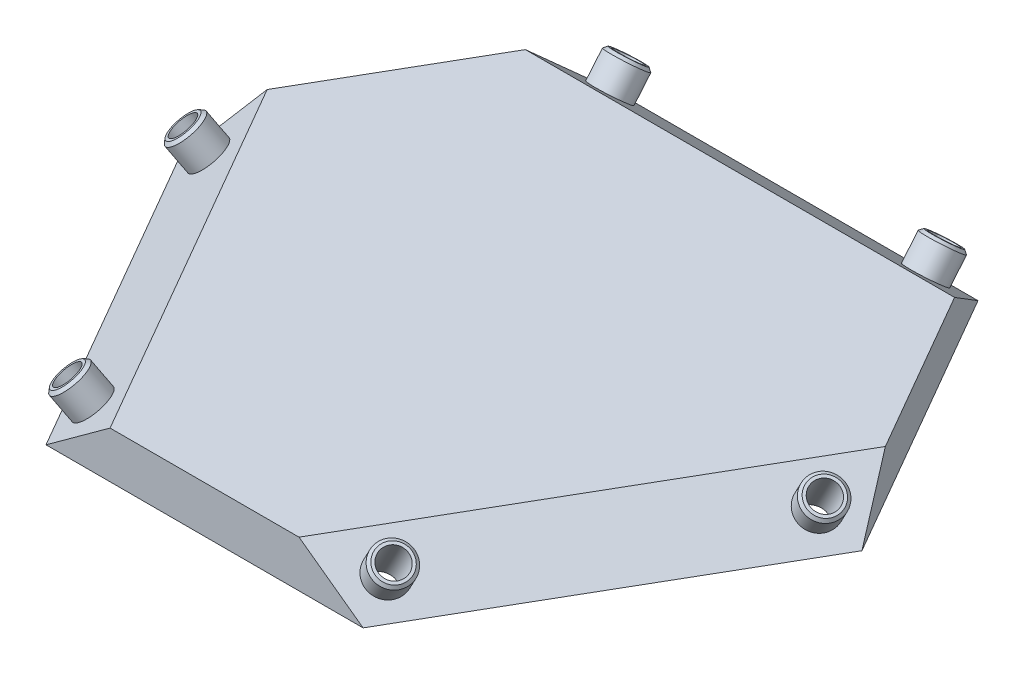
ISO-10303-21;
HEADER;
FILE_DESCRIPTION(('STEP AP214'),'2;1');
FILE_NAME('part.step','',(''),(''),'','','');
FILE_SCHEMA(('AUTOMOTIVE_DESIGN { 1 0 10303 214 1 1 1 1 }'));
ENDSEC;
DATA;
#1=APPLICATION_CONTEXT('core data for automotive mechanical design processes');
#2=APPLICATION_PROTOCOL_DEFINITION('international standard','automotive_design',2000,#1);
#3=PRODUCT_CONTEXT('',#1,'mechanical');
#4=PRODUCT('Part','Part','',(#3));
#5=PRODUCT_RELATED_PRODUCT_CATEGORY('part','',(#4));
#6=PRODUCT_DEFINITION_FORMATION('','',#4);
#7=PRODUCT_DEFINITION_CONTEXT('part definition',#1,'design');
#8=PRODUCT_DEFINITION('design','',#6,#7);
#9=PRODUCT_DEFINITION_SHAPE('','',#8);
#10=(LENGTH_UNIT() NAMED_UNIT(*) SI_UNIT(.MILLI.,.METRE.));
#11=(NAMED_UNIT(*) PLANE_ANGLE_UNIT() SI_UNIT($,.RADIAN.));
#12=(NAMED_UNIT(*) SI_UNIT($,.STERADIAN.) SOLID_ANGLE_UNIT());
#13=UNCERTAINTY_MEASURE_WITH_UNIT(LENGTH_MEASURE(1.E-05),#10,'distance_accuracy_value','');
#14=(GEOMETRIC_REPRESENTATION_CONTEXT(3) GLOBAL_UNCERTAINTY_ASSIGNED_CONTEXT((#13)) GLOBAL_UNIT_ASSIGNED_CONTEXT((#10,
#11,#12)) REPRESENTATION_CONTEXT('',''));
#15=CARTESIAN_POINT('',(0.,0.,0.));
#16=DIRECTION('',(0.,0.,1.));
#17=DIRECTION('',(1.,0.,0.));
#18=AXIS2_PLACEMENT_3D('',#15,#16,#17);
#19=CARTESIAN_POINT('',(0.,8.,-40.043988301124));
#20=DIRECTION('',(0.,0.766044443118981,-0.642787609686536));
#21=DIRECTION('',(1.,0.,0.));
#22=AXIS2_PLACEMENT_3D('',#19,#20,#21);
#23=PLANE('',#22);
#24=CARTESIAN_POINT('',(-27.1283555449519,3.99999999999999,-44.8110026715009));
#25=DIRECTION('',(0.,0.766044443118981,-0.642787609686536));
#26=DIRECTION('',(0.,0.642787609686536,0.766044443118981));
#27=AXIS2_PLACEMENT_3D('',#24,#25,#26);
#28=CIRCLE('',#27,3.30000000000001);
#29=CARTESIAN_POINT('',(-27.1283555449519,6.12119911196556,-42.2830560092083));
#30=VERTEX_POINT('',#29);
#31=EDGE_CURVE('E323',#30,#30,#28,.T.);
#32=ORIENTED_EDGE('',*,*,#31,.F.);
#33=EDGE_LOOP('',(#32));
#34=FACE_BOUND('',#33,.T.);
#35=DIRECTION('',(0.404481746652007,0.587858883152551,0.70058293593548));
#36=VECTOR('',#35,1.);
#37=CARTESIAN_POINT('',(30.8467253995562,-0.76940046901987,-50.4949528149759));
#38=LINE('',#37,#36);
#39=CARTESIAN_POINT('',(31.376118514984,0.,-49.5780170418778));
#40=VERTEX_POINT('',#39);
#41=CARTESIAN_POINT('',(36.8805925749198,8.,-40.043988301124));
#42=VERTEX_POINT('',#41);
#43=EDGE_CURVE('E146',#40,#42,#38,.T.);
#44=ORIENTED_EDGE('',*,*,#43,.F.);
#45=DIRECTION('',(1.,0.,0.));
#46=VECTOR('',#45,1.);
#47=CARTESIAN_POINT('',(0.,0.,-49.5780170418778));
#48=LINE('',#47,#46);
#49=CARTESIAN_POINT('',(-31.376118514984,0.,-49.5780170418778));
#50=VERTEX_POINT('',#49);
#51=EDGE_CURVE('E99',#50,#40,#48,.T.);
#52=ORIENTED_EDGE('',*,*,#51,.F.);
#53=DIRECTION('',(0.404481746652007,-0.587858883152551,-0.70058293593548));
#54=VECTOR('',#53,1.);
#55=CARTESIAN_POINT('',(-30.8467253995562,-0.769400469019868,-50.4949528149759));
#56=LINE('',#55,#54);
#57=CARTESIAN_POINT('',(-36.8805925749198,8.,-40.043988301124));
#58=VERTEX_POINT('',#57);
#59=EDGE_CURVE('E94',#58,#50,#56,.T.);
#60=ORIENTED_EDGE('',*,*,#59,.F.);
#61=DIRECTION('',(-1.,0.,0.));
#62=VECTOR('',#61,1.);
#63=CARTESIAN_POINT('',(-30.,8.,-40.043988301124));
#64=LINE('',#63,#62);
#65=EDGE_CURVE('E98',#42,#58,#64,.T.);
#66=ORIENTED_EDGE('',*,*,#65,.F.);
#67=EDGE_LOOP('',(#44,#52,#60,#66));
#68=FACE_BOUND('',#67,.T.);
#69=CARTESIAN_POINT('',(27.128355544952,3.99999999999999,-44.8110026715009));
#70=DIRECTION('',(0.,0.766044443118981,-0.642787609686536));
#71=DIRECTION('',(0.,0.642787609686536,0.766044443118981));
#72=AXIS2_PLACEMENT_3D('',#69,#70,#71);
#73=CIRCLE('',#72,3.3);
#74=CARTESIAN_POINT('',(27.128355544952,6.12119911196556,-42.2830560092083));
#75=VERTEX_POINT('',#74);
#76=EDGE_CURVE('E329',#75,#75,#73,.T.);
#77=ORIENTED_EDGE('',*,*,#76,.F.);
#78=EDGE_LOOP('',(#77));
#79=FACE_BOUND('',#78,.T.);
#80=ADVANCED_FACE('F39',(#34,#68,#79),#23,.T.);
#81=CARTESIAN_POINT('',(-34.6791111376203,8.,20.021994150562));
#82=DIRECTION('',(-0.556670399226416,0.766044443118981,0.321393804843268));
#83=DIRECTION('',(-0.5,0.,-0.866025403784439));
#84=AXIS2_PLACEMENT_3D('',#81,#82,#83);
#85=PLANE('',#84);
#86=CARTESIAN_POINT('',(-52.3716444550481,3.99999999999999,-1.08834372907434));
#87=DIRECTION('',(-0.556670399226417,0.766044443118981,0.321393804843268));
#88=DIRECTION('',(-0.808963493304015,-0.587858883152552,0.));
#89=AXIS2_PLACEMENT_3D('',#86,#87,#88);
#90=CIRCLE('',#89,3.3);
#91=CARTESIAN_POINT('',(-55.0412239829513,2.06006568559657,-1.08834372907434));
#92=VERTEX_POINT('',#91);
#93=EDGE_CURVE('E310',#92,#92,#90,.T.);
#94=ORIENTED_EDGE('',*,*,#93,.F.);
#95=EDGE_LOOP('',(#94));
#96=FACE_BOUND('',#95,.T.);
#97=DIRECTION('',(0.404481746652007,0.587858883152551,-0.70058293593548));
#98=VECTOR('',#97,1.);
#99=CARTESIAN_POINT('',(-59.1532746004438,-0.769400469019871,-1.46657141209043));
#100=LINE('',#99,#98);
#101=CARTESIAN_POINT('',(-58.623881485016,0.,-2.38350718518854));
#102=VERTEX_POINT('',#101);
#103=CARTESIAN_POINT('',(-53.1194074250802,8.,-11.9175359259423));
#104=VERTEX_POINT('',#103);
#105=EDGE_CURVE('E104',#102,#104,#100,.T.);
#106=ORIENTED_EDGE('',*,*,#105,.F.);
#107=DIRECTION('',(-0.5,0.,-0.866025403784439));
#108=VECTOR('',#107,1.);
#109=CARTESIAN_POINT('',(-42.935822227524,0.,24.7890085209389));
#110=LINE('',#109,#108);
#111=CARTESIAN_POINT('',(-27.247762970032,0.,51.9615242270663));
#112=VERTEX_POINT('',#111);
#113=EDGE_CURVE('E141',#112,#102,#110,.T.);
#114=ORIENTED_EDGE('',*,*,#113,.F.);
#115=DIRECTION('',(-0.808963493304015,-0.587858883152551,0.));
#116=VECTOR('',#115,1.);
#117=CARTESIAN_POINT('',(-28.3065492008876,-0.769400469019875,51.9615242270663));
#118=LINE('',#117,#116);
#119=CARTESIAN_POINT('',(-16.2388148501604,8.,51.9615242270663));
#120=VERTEX_POINT('',#119);
#121=EDGE_CURVE('E62',#120,#112,#118,.T.);
#122=ORIENTED_EDGE('',*,*,#121,.F.);
#123=DIRECTION('',(0.5,0.,0.866025403784439));
#124=VECTOR('',#123,1.);
#125=CARTESIAN_POINT('',(-19.6791111376203,8.,46.0027562640952));
#126=LINE('',#125,#124);
#127=EDGE_CURVE('E116',#104,#120,#126,.T.);
#128=ORIENTED_EDGE('',*,*,#127,.F.);
#129=EDGE_LOOP('',(#106,#114,#122,#128));
#130=FACE_BOUND('',#129,.T.);
#131=CARTESIAN_POINT('',(-25.2432889100962,4.,45.8993464005753));
#132=DIRECTION('',(-0.556670399226417,0.766044443118981,0.321393804843268));
#133=DIRECTION('',(-0.808963493304015,-0.587858883152552,0.));
#134=AXIS2_PLACEMENT_3D('',#131,#132,#133);
#135=CIRCLE('',#134,3.3);
#136=CARTESIAN_POINT('',(-27.9128684379994,2.06006568559657,45.8993464005753));
#137=VERTEX_POINT('',#136);
#138=EDGE_CURVE('E317',#137,#137,#135,.T.);
#139=ORIENTED_EDGE('',*,*,#138,.F.);
#140=EDGE_LOOP('',(#139));
#141=FACE_BOUND('',#140,.T.);
#142=ADVANCED_FACE('F196',(#96,#130,#141),#85,.T.);
#143=CARTESIAN_POINT('',(34.6791111376203,8.,20.021994150562));
#144=DIRECTION('',(0.556670399226416,0.766044443118981,0.321393804843268));
#145=DIRECTION('',(-0.5,0.,0.866025403784439));
#146=AXIS2_PLACEMENT_3D('',#143,#144,#145);
#147=PLANE('',#146);
#148=CARTESIAN_POINT('',(25.2432889100962,3.99999999999999,45.8993464005753));
#149=DIRECTION('',(0.556670399226416,0.766044443118981,0.321393804843268));
#150=DIRECTION('',(-0.808963493304015,0.587858883152551,0.));
#151=AXIS2_PLACEMENT_3D('',#148,#149,#150);
#152=CIRCLE('',#151,3.3);
#153=CARTESIAN_POINT('',(22.5737093821929,5.93993431440341,45.8993464005753));
#154=VERTEX_POINT('',#153);
#155=EDGE_CURVE('E271',#154,#154,#152,.T.);
#156=ORIENTED_EDGE('',*,*,#155,.F.);
#157=EDGE_LOOP('',(#156));
#158=FACE_BOUND('',#157,.T.);
#159=DIRECTION('',(-0.808963493304015,0.587858883152551,0.));
#160=VECTOR('',#159,1.);
#161=CARTESIAN_POINT('',(28.3065492008875,-0.769400469019871,51.9615242270663));
#162=LINE('',#161,#160);
#163=CARTESIAN_POINT('',(27.247762970032,0.,51.9615242270663));
#164=VERTEX_POINT('',#163);
#165=CARTESIAN_POINT('',(16.2388148501603,8.,51.9615242270663));
#166=VERTEX_POINT('',#165);
#167=EDGE_CURVE('E148',#164,#166,#162,.T.);
#168=ORIENTED_EDGE('',*,*,#167,.F.);
#169=DIRECTION('',(-0.5,0.,0.866025403784439));
#170=VECTOR('',#169,1.);
#171=CARTESIAN_POINT('',(42.935822227524,0.,24.7890085209389));
#172=LINE('',#171,#170);
#173=CARTESIAN_POINT('',(58.623881485016,0.,-2.38350718518854));
#174=VERTEX_POINT('',#173);
#175=EDGE_CURVE('E55',#174,#164,#172,.T.);
#176=ORIENTED_EDGE('',*,*,#175,.F.);
#177=DIRECTION('',(0.404481746652007,-0.587858883152551,0.70058293593548));
#178=VECTOR('',#177,1.);
#179=CARTESIAN_POINT('',(59.1532746004438,-0.769400469019871,-1.46657141209044));
#180=LINE('',#179,#178);
#181=CARTESIAN_POINT('',(53.1194074250802,8.,-11.9175359259423));
#182=VERTEX_POINT('',#181);
#183=EDGE_CURVE('E144',#182,#174,#180,.T.);
#184=ORIENTED_EDGE('',*,*,#183,.F.);
#185=DIRECTION('',(0.5,0.,-0.866025403784439));
#186=VECTOR('',#185,1.);
#187=CARTESIAN_POINT('',(49.6791111376202,8.,-5.95876796297116));
#188=LINE('',#187,#186);
#189=EDGE_CURVE('E133',#166,#182,#188,.T.);
#190=ORIENTED_EDGE('',*,*,#189,.F.);
#191=EDGE_LOOP('',(#168,#176,#184,#190));
#192=FACE_BOUND('',#191,.T.);
#193=CARTESIAN_POINT('',(52.3716444550481,3.99999999999998,-1.08834372907436));
#194=DIRECTION('',(0.556670399226416,0.766044443118981,0.321393804843268));
#195=DIRECTION('',(-0.808963493304015,0.587858883152551,0.));
#196=AXIS2_PLACEMENT_3D('',#193,#194,#195);
#197=CIRCLE('',#196,3.29999999999999);
#198=CARTESIAN_POINT('',(49.7020649271449,5.9399343144034,-1.08834372907436));
#199=VERTEX_POINT('',#198);
#200=EDGE_CURVE('E272',#199,#199,#197,.T.);
#201=ORIENTED_EDGE('',*,*,#200,.F.);
#202=EDGE_LOOP('',(#201));
#203=FACE_BOUND('',#202,.T.);
#204=ADVANCED_FACE('F204',(#158,#192,#203),#147,.T.);
#205=CARTESIAN_POINT('',(-30.,8.,-51.9615242270663));
#206=DIRECTION('',(0.866025403784439,0.,0.5));
#207=DIRECTION('',(0.5,0.,-0.866025403784439));
#208=AXIS2_PLACEMENT_3D('',#205,#206,#207);
#209=PLANE('',#208);
#210=DIRECTION('',(-0.5,0.,0.866025403784439));
#211=VECTOR('',#210,1.);
#212=CARTESIAN_POINT('',(-30.,8.,-51.9615242270663));
#213=LINE('',#212,#211);
#214=EDGE_CURVE('E111',#58,#104,#213,.T.);
#215=ORIENTED_EDGE('',*,*,#214,.F.);
#216=ORIENTED_EDGE('',*,*,#59,.T.);
#217=DIRECTION('',(-0.5,0.,0.866025403784439));
#218=VECTOR('',#217,1.);
#219=CARTESIAN_POINT('',(-30.,0.,-51.9615242270663));
#220=LINE('',#219,#218);
#221=EDGE_CURVE('E134',#50,#102,#220,.T.);
#222=ORIENTED_EDGE('',*,*,#221,.T.);
#223=ORIENTED_EDGE('',*,*,#105,.T.);
#224=EDGE_LOOP('',(#215,#216,#222,#223));
#225=FACE_BOUND('',#224,.T.);
#226=ADVANCED_FACE('F118',(#225),#209,.F.);
#227=CARTESIAN_POINT('',(-30.,8.,51.9615242270663));
#228=DIRECTION('',(0.,0.,-1.));
#229=DIRECTION('',(-1.,0.,0.));
#230=AXIS2_PLACEMENT_3D('',#227,#228,#229);
#231=PLANE('',#230);
#232=DIRECTION('',(1.,0.,0.));
#233=VECTOR('',#232,1.);
#234=CARTESIAN_POINT('',(-30.,8.,51.9615242270663));
#235=LINE('',#234,#233);
#236=EDGE_CURVE('E120',#120,#166,#235,.T.);
#237=ORIENTED_EDGE('',*,*,#236,.F.);
#238=ORIENTED_EDGE('',*,*,#121,.T.);
#239=DIRECTION('',(1.,0.,0.));
#240=VECTOR('',#239,1.);
#241=CARTESIAN_POINT('',(-30.,0.,51.9615242270663));
#242=LINE('',#241,#240);
#243=EDGE_CURVE('E126',#112,#164,#242,.T.);
#244=ORIENTED_EDGE('',*,*,#243,.T.);
#245=ORIENTED_EDGE('',*,*,#167,.T.);
#246=EDGE_LOOP('',(#237,#238,#244,#245));
#247=FACE_BOUND('',#246,.T.);
#248=ADVANCED_FACE('F404',(#247),#231,.F.);
#249=CARTESIAN_POINT('',(60.,8.,0.));
#250=DIRECTION('',(-0.866025403784439,0.,0.5));
#251=DIRECTION('',(0.5,0.,0.866025403784439));
#252=AXIS2_PLACEMENT_3D('',#249,#250,#251);
#253=PLANE('',#252);
#254=DIRECTION('',(-0.5,0.,-0.866025403784439));
#255=VECTOR('',#254,1.);
#256=CARTESIAN_POINT('',(60.,0.,0.));
#257=LINE('',#256,#255);
#258=EDGE_CURVE('E121',#174,#40,#257,.T.);
#259=ORIENTED_EDGE('',*,*,#258,.T.);
#260=ORIENTED_EDGE('',*,*,#43,.T.);
#261=DIRECTION('',(-0.5,0.,-0.866025403784439));
#262=VECTOR('',#261,1.);
#263=CARTESIAN_POINT('',(60.,8.,0.));
#264=LINE('',#263,#262);
#265=EDGE_CURVE('E115',#182,#42,#264,.T.);
#266=ORIENTED_EDGE('',*,*,#265,.F.);
#267=ORIENTED_EDGE('',*,*,#183,.T.);
#268=EDGE_LOOP('',(#259,#260,#266,#267));
#269=FACE_BOUND('',#268,.T.);
#270=ADVANCED_FACE('F399',(#269),#253,.F.);
#271=CARTESIAN_POINT('',(0.,8.,0.));
#272=DIRECTION('',(0.,1.,0.));
#273=DIRECTION('',(0.,0.,1.));
#274=AXIS2_PLACEMENT_3D('',#271,#272,#273);
#275=PLANE('',#274);
#276=ORIENTED_EDGE('',*,*,#265,.T.);
#277=ORIENTED_EDGE('',*,*,#65,.T.);
#278=ORIENTED_EDGE('',*,*,#214,.T.);
#279=ORIENTED_EDGE('',*,*,#127,.T.);
#280=ORIENTED_EDGE('',*,*,#236,.T.);
#281=ORIENTED_EDGE('',*,*,#189,.T.);
#282=EDGE_LOOP('',(#276,#277,#278,#279,#280,#281));
#283=FACE_BOUND('',#282,.T.);
#284=ADVANCED_FACE('F109',(#283),#275,.T.);
#285=CARTESIAN_POINT('',(0.,0.,0.));
#286=DIRECTION('',(0.,1.,0.));
#287=DIRECTION('',(0.,0.,1.));
#288=AXIS2_PLACEMENT_3D('',#285,#286,#287);
#289=PLANE('',#288);
#290=CARTESIAN_POINT('',(-49.4649180674254,0.,-2.76654299142889));
#291=DIRECTION('',(0.,1.,0.));
#292=DIRECTION('',(-0.866025403784439,0.,0.5));
#293=AXIS2_PLACEMENT_3D('',#290,#291,#292);
#294=ELLIPSE('',#293,3.00243676546424,2.30000000000001);
#295=CARTESIAN_POINT('',(-52.0651045795738,0.,-1.26532460869677));
#296=VERTEX_POINT('',#295);
#297=EDGE_CURVE('E284',#296,#296,#294,.T.);
#298=ORIENTED_EDGE('',*,*,#297,.T.);
#299=EDGE_LOOP('',(#298));
#300=FACE_BOUND('',#299,.T.);
#301=CARTESIAN_POINT('',(-22.3365625224735,0.,44.2211471382207));
#302=DIRECTION('',(0.,1.,0.));
#303=DIRECTION('',(-0.866025403784439,0.,0.5));
#304=AXIS2_PLACEMENT_3D('',#301,#302,#303);
#305=ELLIPSE('',#304,3.00243676546423,2.3);
#306=CARTESIAN_POINT('',(-24.9367490346219,0.,45.7223655209528));
#307=VERTEX_POINT('',#306);
#308=EDGE_CURVE('E275',#307,#307,#305,.T.);
#309=ORIENTED_EDGE('',*,*,#308,.T.);
#310=EDGE_LOOP('',(#309));
#311=FACE_BOUND('',#310,.T.);
#312=CARTESIAN_POINT('',(-27.1283555449519,0.,-41.4546041467918));
#313=DIRECTION('',(0.,1.,0.));
#314=DIRECTION('',(0.,0.,-1.));
#315=AXIS2_PLACEMENT_3D('',#312,#313,#314);
#316=ELLIPSE('',#315,3.00243676546423,2.3);
#317=CARTESIAN_POINT('',(-27.1283555449519,0.,-44.4570409122561));
#318=VERTEX_POINT('',#317);
#319=EDGE_CURVE('E290',#318,#318,#316,.T.);
#320=ORIENTED_EDGE('',*,*,#319,.T.);
#321=EDGE_LOOP('',(#320));
#322=FACE_BOUND('',#321,.T.);
#323=CARTESIAN_POINT('',(27.128355544952,0.,-41.4546041467918));
#324=DIRECTION('',(0.,1.,0.));
#325=DIRECTION('',(0.,0.,-1.));
#326=AXIS2_PLACEMENT_3D('',#323,#324,#325);
#327=ELLIPSE('',#326,3.00243676546423,2.3);
#328=CARTESIAN_POINT('',(27.128355544952,0.,-44.4570409122561));
#329=VERTEX_POINT('',#328);
#330=EDGE_CURVE('E287',#329,#329,#327,.T.);
#331=ORIENTED_EDGE('',*,*,#330,.T.);
#332=EDGE_LOOP('',(#331));
#333=FACE_BOUND('',#332,.T.);
#334=CARTESIAN_POINT('',(49.4649180674254,0.,-2.76654299142889));
#335=DIRECTION('',(0.,1.,0.));
#336=DIRECTION('',(0.866025403784439,0.,0.5));
#337=AXIS2_PLACEMENT_3D('',#334,#335,#336);
#338=ELLIPSE('',#337,3.00243676546422,2.29999999999999);
#339=CARTESIAN_POINT('',(52.0651045795738,0.,-1.26532460869678));
#340=VERTEX_POINT('',#339);
#341=EDGE_CURVE('E129',#340,#340,#338,.T.);
#342=ORIENTED_EDGE('',*,*,#341,.T.);
#343=EDGE_LOOP('',(#342));
#344=FACE_BOUND('',#343,.T.);
#345=CARTESIAN_POINT('',(22.3365625224735,0.,44.2211471382207));
#346=DIRECTION('',(0.,1.,0.));
#347=DIRECTION('',(0.866025403784439,0.,0.5));
#348=AXIS2_PLACEMENT_3D('',#345,#346,#347);
#349=ELLIPSE('',#348,3.00243676546423,2.3);
#350=CARTESIAN_POINT('',(24.9367490346219,0.,45.7223655209528));
#351=VERTEX_POINT('',#350);
#352=EDGE_CURVE('E292',#351,#351,#349,.T.);
#353=ORIENTED_EDGE('',*,*,#352,.T.);
#354=EDGE_LOOP('',(#353));
#355=FACE_BOUND('',#354,.T.);
#356=ORIENTED_EDGE('',*,*,#221,.F.);
#357=ORIENTED_EDGE('',*,*,#51,.T.);
#358=ORIENTED_EDGE('',*,*,#258,.F.);
#359=ORIENTED_EDGE('',*,*,#175,.T.);
#360=ORIENTED_EDGE('',*,*,#243,.F.);
#361=ORIENTED_EDGE('',*,*,#113,.T.);
#362=EDGE_LOOP('',(#356,#357,#358,#359,#360,#361));
#363=FACE_BOUND('',#362,.T.);
#364=ADVANCED_FACE('F299',(#300,#311,#322,#333,#344,#355,#363),#289,.F.);
#365=CARTESIAN_POINT('',(-19.5332640322336,-57.6178435410992,20.0475915059377));
#366=DIRECTION('',(0.556670399226416,0.766044443118981,0.321393804843268));
#367=DIRECTION('',(-0.808963493304015,0.587858883152551,0.));
#368=AXIS2_PLACEMENT_3D('',#365,#366,#367);
#369=CYLINDRICAL_SURFACE('',#368,2.3);
#370=ORIENTED_EDGE('',*,*,#352,.F.);
#371=EDGE_LOOP('',(#370));
#372=FACE_BOUND('',#371,.T.);
#373=CARTESIAN_POINT('',(28.0266409062282,7.83022221559489,47.5063154247916));
#374=DIRECTION('',(0.556670399226416,0.766044443118981,0.321393804843268));
#375=DIRECTION('',(-0.808963493304015,0.587858883152551,0.));
#376=AXIS2_PLACEMENT_3D('',#373,#374,#375);
#377=CIRCLE('',#376,2.30000000000001);
#378=CARTESIAN_POINT('',(26.166024871629,9.18229764684577,47.5063154247916));
#379=VERTEX_POINT('',#378);
#380=EDGE_CURVE('E269',#379,#379,#377,.T.);
#381=ORIENTED_EDGE('',*,*,#380,.T.);
#382=EDGE_LOOP('',(#381));
#383=FACE_BOUND('',#382,.T.);
#384=ADVANCED_FACE('F305',(#372,#383),#369,.F.);
#385=CARTESIAN_POINT('',(7.59509151271837,-57.6178435410992,-26.9400986237119));
#386=DIRECTION('',(0.556670399226416,0.766044443118981,0.321393804843268));
#387=DIRECTION('',(-0.808963493304015,0.587858883152551,0.));
#388=AXIS2_PLACEMENT_3D('',#385,#386,#387);
#389=CYLINDRICAL_SURFACE('',#388,2.29999999999999);
#390=ORIENTED_EDGE('',*,*,#341,.F.);
#391=EDGE_LOOP('',(#390));
#392=FACE_BOUND('',#391,.T.);
#393=CARTESIAN_POINT('',(55.1549964511802,7.83022221559489,0.518625295141983));
#394=DIRECTION('',(0.556670399226416,0.766044443118981,0.321393804843268));
#395=DIRECTION('',(-0.808963493304015,0.587858883152551,0.));
#396=AXIS2_PLACEMENT_3D('',#393,#394,#395);
#397=CIRCLE('',#396,2.29999999999999);
#398=CARTESIAN_POINT('',(53.294380416581,9.18229764684575,0.518625295141983));
#399=VERTEX_POINT('',#398);
#400=EDGE_CURVE('E278',#399,#399,#397,.T.);
#401=ORIENTED_EDGE('',*,*,#400,.T.);
#402=EDGE_LOOP('',(#401));
#403=FACE_BOUND('',#402,.T.);
#404=ADVANCED_FACE('F301',(#392,#403),#389,.F.);
#405=CARTESIAN_POINT('',(27.128355544952,-45.9984637394795,-2.85731018827343));
#406=DIRECTION('',(0.,0.766044443118981,-0.642787609686536));
#407=DIRECTION('',(0.,0.642787609686536,0.766044443118981));
#408=AXIS2_PLACEMENT_3D('',#405,#406,#407);
#409=CYLINDRICAL_SURFACE('',#408,2.3);
#410=ORIENTED_EDGE('',*,*,#330,.F.);
#411=EDGE_LOOP('',(#410));
#412=FACE_BOUND('',#411,.T.);
#413=CARTESIAN_POINT('',(27.128355544952,7.8302222155949,-48.0249407199336));
#414=DIRECTION('',(0.,0.766044443118981,-0.642787609686536));
#415=DIRECTION('',(0.,0.642787609686536,0.766044443118981));
#416=AXIS2_PLACEMENT_3D('',#413,#414,#415);
#417=CIRCLE('',#416,2.3);
#418=CARTESIAN_POINT('',(27.128355544952,9.30863371787393,-46.2630385007599));
#419=VERTEX_POINT('',#418);
#420=EDGE_CURVE('E332',#419,#419,#417,.T.);
#421=ORIENTED_EDGE('',*,*,#420,.T.);
#422=EDGE_LOOP('',(#421));
#423=FACE_BOUND('',#422,.T.);
#424=ADVANCED_FACE('F304',(#412,#423),#409,.F.);
#425=CARTESIAN_POINT('',(-27.1283555449519,-45.9984637394795,-2.85731018827342));
#426=DIRECTION('',(0.,0.766044443118981,-0.642787609686536));
#427=DIRECTION('',(0.,0.642787609686536,0.766044443118981));
#428=AXIS2_PLACEMENT_3D('',#425,#426,#427);
#429=CYLINDRICAL_SURFACE('',#428,2.3);
#430=ORIENTED_EDGE('',*,*,#319,.F.);
#431=EDGE_LOOP('',(#430));
#432=FACE_BOUND('',#431,.T.);
#433=CARTESIAN_POINT('',(-27.1283555449519,7.8302222155949,-48.0249407199336));
#434=DIRECTION('',(0.,0.766044443118981,-0.642787609686536));
#435=DIRECTION('',(0.,0.642787609686536,0.766044443118981));
#436=AXIS2_PLACEMENT_3D('',#433,#434,#435);
#437=CIRCLE('',#436,2.3);
#438=CARTESIAN_POINT('',(-27.1283555449519,9.30863371787393,-46.2630385007599));
#439=VERTEX_POINT('',#438);
#440=EDGE_CURVE('E326',#439,#439,#437,.T.);
#441=ORIENTED_EDGE('',*,*,#440,.T.);
#442=EDGE_LOOP('',(#441));
#443=FACE_BOUND('',#442,.T.);
#444=ADVANCED_FACE('F386',(#432,#443),#429,.F.);
#445=CARTESIAN_POINT('',(19.5332640322336,-57.6178435410992,20.0475915059377));
#446=DIRECTION('',(-0.556670399226416,0.766044443118981,0.321393804843268));
#447=DIRECTION('',(-0.808963493304015,-0.587858883152552,0.));
#448=AXIS2_PLACEMENT_3D('',#445,#446,#447);
#449=CYLINDRICAL_SURFACE('',#448,2.3);
#450=ORIENTED_EDGE('',*,*,#308,.F.);
#451=EDGE_LOOP('',(#450));
#452=FACE_BOUND('',#451,.T.);
#453=CARTESIAN_POINT('',(-28.0266409062283,7.8302222155949,47.5063154247916));
#454=DIRECTION('',(-0.556670399226417,0.766044443118981,0.321393804843268));
#455=DIRECTION('',(-0.808963493304015,-0.587858883152552,0.));
#456=AXIS2_PLACEMENT_3D('',#453,#454,#455);
#457=CIRCLE('',#456,2.30000000000001);
#458=CARTESIAN_POINT('',(-29.8872569408275,6.47814678434403,47.5063154247916));
#459=VERTEX_POINT('',#458);
#460=EDGE_CURVE('E320',#459,#459,#457,.T.);
#461=ORIENTED_EDGE('',*,*,#460,.T.);
#462=EDGE_LOOP('',(#461));
#463=FACE_BOUND('',#462,.T.);
#464=ADVANCED_FACE('F382',(#452,#463),#449,.F.);
#465=CARTESIAN_POINT('',(-7.59509151271835,-57.6178435410992,-26.9400986237119));
#466=DIRECTION('',(-0.556670399226416,0.766044443118981,0.321393804843268));
#467=DIRECTION('',(-0.808963493304015,-0.587858883152552,0.));
#468=AXIS2_PLACEMENT_3D('',#465,#466,#467);
#469=CYLINDRICAL_SURFACE('',#468,2.30000000000001);
#470=ORIENTED_EDGE('',*,*,#297,.F.);
#471=EDGE_LOOP('',(#470));
#472=FACE_BOUND('',#471,.T.);
#473=CARTESIAN_POINT('',(-55.1549964511802,7.8302222155949,0.518625295142001));
#474=DIRECTION('',(-0.556670399226417,0.766044443118981,0.321393804843268));
#475=DIRECTION('',(-0.808963493304015,-0.587858883152552,0.));
#476=AXIS2_PLACEMENT_3D('',#473,#474,#475);
#477=CIRCLE('',#476,2.3);
#478=CARTESIAN_POINT('',(-57.0156124857794,6.47814678434403,0.518625295142001));
#479=VERTEX_POINT('',#478);
#480=EDGE_CURVE('E312',#479,#479,#477,.T.);
#481=ORIENTED_EDGE('',*,*,#480,.T.);
#482=EDGE_LOOP('',(#481));
#483=FACE_BOUND('',#482,.T.);
#484=ADVANCED_FACE('F265',(#472,#483),#469,.F.);
#485=CARTESIAN_POINT('',(28.0266409062282,7.83022221559489,47.5063154247916));
#486=DIRECTION('',(0.556670399226416,0.766044443118981,0.321393804843268));
#487=DIRECTION('',(-0.808963493304015,0.587858883152551,0.));
#488=AXIS2_PLACEMENT_3D('',#485,#486,#487);
#489=PLANE('',#488);
#490=CARTESIAN_POINT('',(28.0266409062282,7.8302222155949,47.5063154247916));
#491=DIRECTION('',(0.556670399226416,0.766044443118981,0.321393804843268));
#492=DIRECTION('',(-0.808963493304015,0.587858883152551,0.));
#493=AXIS2_PLACEMENT_3D('',#490,#491,#492);
#494=CIRCLE('',#493,2.79999999999999);
#495=CARTESIAN_POINT('',(25.761543124977,9.47622708842203,47.5063154247916));
#496=VERTEX_POINT('',#495);
#497=EDGE_CURVE('E169',#496,#496,#494,.T.);
#498=ORIENTED_EDGE('',*,*,#497,.T.);
#499=EDGE_LOOP('',(#498));
#500=FACE_BOUND('',#499,.T.);
#501=ORIENTED_EDGE('',*,*,#380,.F.);
#502=EDGE_LOOP('',(#501));
#503=FACE_BOUND('',#502,.T.);
#504=ADVANCED_FACE('F261',(#500,#503),#489,.T.);
#505=CARTESIAN_POINT('',(28.0266409062282,7.83022221559489,47.5063154247916));
#506=DIRECTION('',(-0.556670399226416,-0.766044443118981,-0.321393804843268));
#507=DIRECTION('',(0.808963493304015,-0.587858883152551,0.));
#508=AXIS2_PLACEMENT_3D('',#505,#506,#507);
#509=CYLINDRICAL_SURFACE('',#508,3.3);
#510=CARTESIAN_POINT('',(27.748305706615,7.4471999940354,47.34561852237));
#511=DIRECTION('',(0.556670399226414,0.766044443118981,0.321393804843272));
#512=DIRECTION('',(-0.808963493304016,0.587858883152549,0.));
#513=AXIS2_PLACEMENT_3D('',#510,#511,#512);
#514=CIRCLE('',#513,3.3);
#515=CARTESIAN_POINT('',(25.0787261787118,9.38713430843881,47.34561852237));
#516=VERTEX_POINT('',#515);
#517=EDGE_CURVE('E172',#516,#516,#514,.F.);
#518=ORIENTED_EDGE('',*,*,#517,.T.);
#519=EDGE_LOOP('',(#518));
#520=FACE_BOUND('',#519,.T.);
#521=ORIENTED_EDGE('',*,*,#155,.T.);
#522=EDGE_LOOP('',(#521));
#523=FACE_BOUND('',#522,.T.);
#524=ADVANCED_FACE('F264',(#520,#523),#509,.T.);
#525=CARTESIAN_POINT('',(55.1549964511802,7.83022221559489,0.518625295141983));
#526=DIRECTION('',(0.556670399226416,0.766044443118981,0.321393804843268));
#527=DIRECTION('',(-0.808963493304015,0.587858883152551,0.));
#528=AXIS2_PLACEMENT_3D('',#525,#526,#527);
#529=PLANE('',#528);
#530=CARTESIAN_POINT('',(55.1549964511802,7.83022221559489,0.518625295141983));
#531=DIRECTION('',(0.556670399226416,0.766044443118981,0.321393804843268));
#532=DIRECTION('',(-0.808963493304015,0.587858883152551,0.));
#533=AXIS2_PLACEMENT_3D('',#530,#531,#532);
#534=CIRCLE('',#533,2.79999999999993);
#535=CARTESIAN_POINT('',(52.889898669929,9.47622708842199,0.518625295141983));
#536=VERTEX_POINT('',#535);
#537=EDGE_CURVE('E163',#536,#536,#534,.T.);
#538=ORIENTED_EDGE('',*,*,#537,.T.);
#539=EDGE_LOOP('',(#538));
#540=FACE_BOUND('',#539,.T.);
#541=ORIENTED_EDGE('',*,*,#400,.F.);
#542=EDGE_LOOP('',(#541));
#543=FACE_BOUND('',#542,.T.);
#544=ADVANCED_FACE('F370',(#540,#543),#529,.T.);
#545=CARTESIAN_POINT('',(55.1549964511802,7.83022221559489,0.518625295141983));
#546=DIRECTION('',(-0.556670399226416,-0.766044443118981,-0.321393804843268));
#547=DIRECTION('',(0.808963493304015,-0.587858883152551,0.));
#548=AXIS2_PLACEMENT_3D('',#545,#546,#547);
#549=CYLINDRICAL_SURFACE('',#548,3.29999999999999);
#550=CARTESIAN_POINT('',(54.876661251567,7.44719999403535,0.357928392720331));
#551=DIRECTION('',(0.556670399226416,0.766044443118981,0.321393804843268));
#552=DIRECTION('',(-0.808963493304015,0.587858883152551,0.));
#553=AXIS2_PLACEMENT_3D('',#550,#551,#552);
#554=CIRCLE('',#553,3.29999999999999);
#555=CARTESIAN_POINT('',(52.2070817236637,9.38713430843876,0.357928392720331));
#556=VERTEX_POINT('',#555);
#557=EDGE_CURVE('E166',#556,#556,#554,.F.);
#558=ORIENTED_EDGE('',*,*,#557,.T.);
#559=EDGE_LOOP('',(#558));
#560=FACE_BOUND('',#559,.T.);
#561=ORIENTED_EDGE('',*,*,#200,.T.);
#562=EDGE_LOOP('',(#561));
#563=FACE_BOUND('',#562,.T.);
#564=ADVANCED_FACE('F366',(#560,#563),#549,.T.);
#565=CARTESIAN_POINT('',(-55.1549964511802,7.8302222155949,0.518625295142001));
#566=DIRECTION('',(-0.556670399226417,0.766044443118981,0.321393804843268));
#567=DIRECTION('',(-0.808963493304015,-0.587858883152552,0.));
#568=AXIS2_PLACEMENT_3D('',#565,#566,#567);
#569=PLANE('',#568);
#570=CARTESIAN_POINT('',(-55.1549964511802,7.8302222155949,0.518625295142002));
#571=DIRECTION('',(-0.556670399226417,0.766044443118981,0.321393804843268));
#572=DIRECTION('',(-0.808963493304015,-0.587858883152552,0.));
#573=AXIS2_PLACEMENT_3D('',#570,#571,#572);
#574=CIRCLE('',#573,2.80000000000001);
#575=CARTESIAN_POINT('',(-57.4200942324314,6.18421734276775,0.518625295142002));
#576=VERTEX_POINT('',#575);
#577=EDGE_CURVE('E48',#576,#576,#574,.T.);
#578=ORIENTED_EDGE('',*,*,#577,.T.);
#579=EDGE_LOOP('',(#578));
#580=FACE_BOUND('',#579,.T.);
#581=ORIENTED_EDGE('',*,*,#480,.F.);
#582=EDGE_LOOP('',(#581));
#583=FACE_BOUND('',#582,.T.);
#584=ADVANCED_FACE('F183',(#580,#583),#569,.T.);
#585=CARTESIAN_POINT('',(-55.1549964511802,7.8302222155949,0.518625295142001));
#586=DIRECTION('',(0.556670399226416,-0.766044443118981,-0.321393804843268));
#587=DIRECTION('',(0.808963493304015,0.587858883152552,0.));
#588=AXIS2_PLACEMENT_3D('',#585,#586,#587);
#589=CYLINDRICAL_SURFACE('',#588,3.3);
#590=CARTESIAN_POINT('',(-54.876661251567,7.44719999403541,0.357928392720369));
#591=DIRECTION('',(-0.556670399226417,0.766044443118981,0.321393804843268));
#592=DIRECTION('',(-0.808963493304014,-0.587858883152552,0.));
#593=AXIS2_PLACEMENT_3D('',#590,#591,#592);
#594=CIRCLE('',#593,3.3);
#595=CARTESIAN_POINT('',(-57.5462407794702,5.50726567963199,0.357928392720369));
#596=VERTEX_POINT('',#595);
#597=EDGE_CURVE('E11',#596,#596,#594,.F.);
#598=ORIENTED_EDGE('',*,*,#597,.T.);
#599=EDGE_LOOP('',(#598));
#600=FACE_BOUND('',#599,.T.);
#601=ORIENTED_EDGE('',*,*,#93,.T.);
#602=EDGE_LOOP('',(#601));
#603=FACE_BOUND('',#602,.T.);
#604=ADVANCED_FACE('F359',(#600,#603),#589,.T.);
#605=CARTESIAN_POINT('',(-28.0266409062283,7.8302222155949,47.5063154247916));
#606=DIRECTION('',(-0.556670399226417,0.766044443118981,0.321393804843268));
#607=DIRECTION('',(-0.808963493304015,-0.587858883152552,0.));
#608=AXIS2_PLACEMENT_3D('',#605,#606,#607);
#609=PLANE('',#608);
#610=CARTESIAN_POINT('',(-28.0266409062283,7.8302222155949,47.5063154247916));
#611=DIRECTION('',(-0.556670399226417,0.766044443118981,0.321393804843268));
#612=DIRECTION('',(-0.808963493304015,-0.587858883152552,0.));
#613=AXIS2_PLACEMENT_3D('',#610,#611,#612);
#614=CIRCLE('',#613,2.80000000000002);
#615=CARTESIAN_POINT('',(-30.2917386874795,6.18421734276775,47.5063154247916));
#616=VERTEX_POINT('',#615);
#617=EDGE_CURVE('E175',#616,#616,#614,.T.);
#618=ORIENTED_EDGE('',*,*,#617,.T.);
#619=EDGE_LOOP('',(#618));
#620=FACE_BOUND('',#619,.T.);
#621=ORIENTED_EDGE('',*,*,#460,.F.);
#622=EDGE_LOOP('',(#621));
#623=FACE_BOUND('',#622,.T.);
#624=ADVANCED_FACE('F356',(#620,#623),#609,.T.);
#625=CARTESIAN_POINT('',(-28.0266409062283,7.8302222155949,47.5063154247916));
#626=DIRECTION('',(0.556670399226416,-0.766044443118981,-0.321393804843268));
#627=DIRECTION('',(0.808963493304015,0.587858883152552,0.));
#628=AXIS2_PLACEMENT_3D('',#625,#626,#627);
#629=CYLINDRICAL_SURFACE('',#628,3.3);
#630=CARTESIAN_POINT('',(-27.7483057066151,7.44719999403542,47.34561852237));
#631=DIRECTION('',(-0.556670399226416,0.766044443118979,0.321393804843272));
#632=DIRECTION('',(-0.808963493304014,-0.587858883152552,0.));
#633=AXIS2_PLACEMENT_3D('',#630,#631,#632);
#634=CIRCLE('',#633,3.3);
#635=CARTESIAN_POINT('',(-30.4178852345183,5.50726567963199,47.34561852237));
#636=VERTEX_POINT('',#635);
#637=EDGE_CURVE('E178',#636,#636,#634,.F.);
#638=ORIENTED_EDGE('',*,*,#637,.T.);
#639=EDGE_LOOP('',(#638));
#640=FACE_BOUND('',#639,.T.);
#641=ORIENTED_EDGE('',*,*,#138,.T.);
#642=EDGE_LOOP('',(#641));
#643=FACE_BOUND('',#642,.T.);
#644=ADVANCED_FACE('F353',(#640,#643),#629,.T.);
#645=CARTESIAN_POINT('',(-27.1283555449519,7.8302222155949,-48.0249407199336));
#646=DIRECTION('',(0.,0.766044443118981,-0.642787609686536));
#647=DIRECTION('',(0.,0.642787609686536,0.766044443118981));
#648=AXIS2_PLACEMENT_3D('',#645,#646,#647);
#649=PLANE('',#648);
#650=CARTESIAN_POINT('',(-27.1283555449519,7.8302222155949,-48.0249407199336));
#651=DIRECTION('',(0.,0.766044443118981,-0.642787609686536));
#652=DIRECTION('',(0.,0.642787609686536,0.766044443118981));
#653=AXIS2_PLACEMENT_3D('',#650,#651,#652);
#654=CIRCLE('',#653,2.79999999999999);
#655=CARTESIAN_POINT('',(-27.1283555449519,6.0304169084726,-50.1698651606667));
#656=VERTEX_POINT('',#655);
#657=EDGE_CURVE('E151',#656,#656,#654,.T.);
#658=ORIENTED_EDGE('',*,*,#657,.T.);
#659=EDGE_LOOP('',(#658));
#660=FACE_BOUND('',#659,.T.);
#661=ORIENTED_EDGE('',*,*,#440,.F.);
#662=EDGE_LOOP('',(#661));
#663=FACE_BOUND('',#662,.T.);
#664=ADVANCED_FACE('F348',(#660,#663),#649,.T.);
#665=CARTESIAN_POINT('',(-27.1283555449519,7.8302222155949,-48.0249407199336));
#666=DIRECTION('',(0.,-0.766044443118981,0.642787609686536));
#667=DIRECTION('',(0.,-0.642787609686536,-0.766044443118981));
#668=AXIS2_PLACEMENT_3D('',#665,#666,#667);
#669=CYLINDRICAL_SURFACE('',#668,3.30000000000001);
#670=CARTESIAN_POINT('',(-27.1283555449519,7.4471999940354,-47.7035469150903));
#671=DIRECTION('',(0.,0.766044443118981,-0.642787609686535));
#672=DIRECTION('',(0.,0.642787609686535,0.766044443118981));
#673=AXIS2_PLACEMENT_3D('',#670,#671,#672);
#674=CIRCLE('',#673,3.30000000000001);
#675=CARTESIAN_POINT('',(-27.1283555449519,5.32600088206983,-50.231493577383));
#676=VERTEX_POINT('',#675);
#677=EDGE_CURVE('E154',#676,#676,#674,.F.);
#678=ORIENTED_EDGE('',*,*,#677,.T.);
#679=EDGE_LOOP('',(#678));
#680=FACE_BOUND('',#679,.T.);
#681=ORIENTED_EDGE('',*,*,#31,.T.);
#682=EDGE_LOOP('',(#681));
#683=FACE_BOUND('',#682,.T.);
#684=ADVANCED_FACE('F339',(#680,#683),#669,.T.);
#685=CARTESIAN_POINT('',(27.128355544952,7.8302222155949,-48.0249407199336));
#686=DIRECTION('',(0.,0.766044443118981,-0.642787609686536));
#687=DIRECTION('',(0.,0.642787609686536,0.766044443118981));
#688=AXIS2_PLACEMENT_3D('',#685,#686,#687);
#689=PLANE('',#688);
#690=CARTESIAN_POINT('',(27.128355544952,7.8302222155949,-48.0249407199336));
#691=DIRECTION('',(0.,0.766044443118981,-0.642787609686536));
#692=DIRECTION('',(0.,0.642787609686536,0.766044443118981));
#693=AXIS2_PLACEMENT_3D('',#690,#691,#692);
#694=CIRCLE('',#693,2.79999999999995);
#695=CARTESIAN_POINT('',(27.128355544952,9.63002752271716,-45.8800162792005));
#696=VERTEX_POINT('',#695);
#697=EDGE_CURVE('E157',#696,#696,#694,.T.);
#698=ORIENTED_EDGE('',*,*,#697,.T.);
#699=EDGE_LOOP('',(#698));
#700=FACE_BOUND('',#699,.T.);
#701=ORIENTED_EDGE('',*,*,#420,.F.);
#702=EDGE_LOOP('',(#701));
#703=FACE_BOUND('',#702,.T.);
#704=ADVANCED_FACE('F337',(#700,#703),#689,.T.);
#705=CARTESIAN_POINT('',(27.128355544952,7.8302222155949,-48.0249407199336));
#706=DIRECTION('',(0.,-0.766044443118981,0.642787609686536));
#707=DIRECTION('',(0.,-0.642787609686536,-0.766044443118981));
#708=AXIS2_PLACEMENT_3D('',#705,#706,#707);
#709=CYLINDRICAL_SURFACE('',#708,3.3);
#710=CARTESIAN_POINT('',(27.128355544952,7.44719999403537,-47.7035469150903));
#711=DIRECTION('',(0.,0.766044443118982,-0.642787609686535));
#712=DIRECTION('',(0.,0.642787609686535,0.766044443118982));
#713=AXIS2_PLACEMENT_3D('',#710,#711,#712);
#714=CIRCLE('',#713,3.3);
#715=CARTESIAN_POINT('',(27.128355544952,9.56839910600093,-45.1756002527977));
#716=VERTEX_POINT('',#715);
#717=EDGE_CURVE('E160',#716,#716,#714,.F.);
#718=ORIENTED_EDGE('',*,*,#717,.T.);
#719=EDGE_LOOP('',(#718));
#720=FACE_BOUND('',#719,.T.);
#721=ORIENTED_EDGE('',*,*,#76,.T.);
#722=EDGE_LOOP('',(#721));
#723=FACE_BOUND('',#722,.T.);
#724=ADVANCED_FACE('F231',(#720,#723),#709,.T.);
#725=CARTESIAN_POINT('',(-27.1283555449519,7.8302222155949,-48.0249407199336));
#726=DIRECTION('',(0.,-0.766044443118981,0.642787609686535));
#727=DIRECTION('',(0.,-0.642787609686535,-0.766044443118981));
#728=AXIS2_PLACEMENT_3D('',#725,#726,#727);
#729=CONICAL_SURFACE('',#728,2.79999999999999,0.78539816339745);
#730=CARTESIAN_POINT('',(-27.1283555449519,5.32600088206983,-50.231493577383));
#731=CARTESIAN_POINT('',(-27.1283555449519,5.33333854901152,-50.2308516147088));
#732=CARTESIAN_POINT('',(-27.1283555449519,5.34067621595322,-50.2302096520347));
#733=CARTESIAN_POINT('',(-27.1283555449519,5.35535154983661,-50.2289257266864));
#734=CARTESIAN_POINT('',(-27.1283555449519,5.36268921677831,-50.2282837640123));
#735=CARTESIAN_POINT('',(-27.1283555449519,5.3773645506617,-50.2269998386641));
#736=CARTESIAN_POINT('',(-27.1283555449519,5.38470221760339,-50.2263578759899));
#737=CARTESIAN_POINT('',(-27.1283555449519,5.39937755148678,-50.2250739506417));
#738=CARTESIAN_POINT('',(-27.1283555449519,5.40671521842848,-50.2244319879676));
#739=CARTESIAN_POINT('',(-27.1283555449519,5.42139055231187,-50.2231480626193));
#740=CARTESIAN_POINT('',(-27.1283555449519,5.42872821925357,-50.2225060999452));
#741=CARTESIAN_POINT('',(-27.1283555449519,5.44340355313696,-50.2212221745969));
#742=CARTESIAN_POINT('',(-27.1283555449519,5.45074122007865,-50.2205802119228));
#743=CARTESIAN_POINT('',(-27.1283555449519,5.46541655396204,-50.2192962865745));
#744=CARTESIAN_POINT('',(-27.1283555449519,5.47275422090374,-50.2186543239004));
#745=CARTESIAN_POINT('',(-27.1283555449519,5.48742955478713,-50.2173703985522));
#746=CARTESIAN_POINT('',(-27.1283555449519,5.49476722172883,-50.216728435878));
#747=CARTESIAN_POINT('',(-27.1283555449519,5.50944255561222,-50.2154445105298));
#748=CARTESIAN_POINT('',(-27.1283555449519,5.51678022255391,-50.2148025478556));
#749=CARTESIAN_POINT('',(-27.1283555449519,5.5314555564373,-50.2135186225074));
#750=CARTESIAN_POINT('',(-27.1283555449519,5.538793223379,-50.2128766598333));
#751=CARTESIAN_POINT('',(-27.1283555449519,5.55346855726239,-50.211592734485));
#752=CARTESIAN_POINT('',(-27.1283555449519,5.56080622420409,-50.2109507718109));
#753=CARTESIAN_POINT('',(-27.1283555449519,5.57548155808748,-50.2096668464626));
#754=CARTESIAN_POINT('',(-27.1283555449519,5.58281922502917,-50.2090248837885));
#755=CARTESIAN_POINT('',(-27.1283555449519,5.59749455891256,-50.2077409584402));
#756=CARTESIAN_POINT('',(-27.1283555449519,5.60483222585426,-50.2070989957661));
#757=CARTESIAN_POINT('',(-27.1283555449519,5.61950755973765,-50.2058150704179));
#758=CARTESIAN_POINT('',(-27.1283555449519,5.62684522667935,-50.2051731077437));
#759=CARTESIAN_POINT('',(-27.1283555449519,5.64152056056274,-50.2038891823955));
#760=CARTESIAN_POINT('',(-27.1283555449519,5.64885822750443,-50.2032472197214));
#761=CARTESIAN_POINT('',(-27.1283555449519,5.66353356138782,-50.2019632943731));
#762=CARTESIAN_POINT('',(-27.1283555449519,5.67087122832952,-50.201321331699));
#763=CARTESIAN_POINT('',(-27.1283555449519,5.68554656221291,-50.2000374063507));
#764=CARTESIAN_POINT('',(-27.1283555449519,5.69288422915461,-50.1993954436766));
#765=CARTESIAN_POINT('',(-27.1283555449519,5.707559563038,-50.1981115183283));
#766=CARTESIAN_POINT('',(-27.1283555449519,5.71489722997969,-50.1974695556542));
#767=CARTESIAN_POINT('',(-27.1283555449519,5.72957256386308,-50.196185630306));
#768=CARTESIAN_POINT('',(-27.1283555449519,5.73691023080478,-50.1955436676318));
#769=CARTESIAN_POINT('',(-27.1283555449519,5.75158556468817,-50.1942597422836));
#770=CARTESIAN_POINT('',(-27.1283555449519,5.75892323162987,-50.1936177796094));
#771=CARTESIAN_POINT('',(-27.1283555449519,5.77359856551326,-50.1923338542612));
#772=CARTESIAN_POINT('',(-27.1283555449519,5.78093623245495,-50.1916918915871));
#773=CARTESIAN_POINT('',(-27.1283555449519,5.79561156633834,-50.1904079662388));
#774=CARTESIAN_POINT('',(-27.1283555449519,5.80294923328004,-50.1897660035647));
#775=CARTESIAN_POINT('',(-27.1283555449519,5.81762456716343,-50.1884820782164));
#776=CARTESIAN_POINT('',(-27.1283555449519,5.82496223410513,-50.1878401155423));
#777=CARTESIAN_POINT('',(-27.1283555449519,5.83963756798852,-50.186556190194));
#778=CARTESIAN_POINT('',(-27.1283555449519,5.84697523493021,-50.1859142275199));
#779=CARTESIAN_POINT('',(-27.1283555449519,5.8616505688136,-50.1846303021717));
#780=CARTESIAN_POINT('',(-27.1283555449519,5.8689882357553,-50.1839883394975));
#781=CARTESIAN_POINT('',(-27.1283555449519,5.88366356963869,-50.1827044141493));
#782=CARTESIAN_POINT('',(-27.1283555449519,5.89100123658039,-50.1820624514751));
#783=CARTESIAN_POINT('',(-27.1283555449519,5.90567657046378,-50.1807785261269));
#784=CARTESIAN_POINT('',(-27.1283555449519,5.91301423740547,-50.1801365634528));
#785=CARTESIAN_POINT('',(-27.1283555449519,5.92768957128886,-50.1788526381045));
#786=CARTESIAN_POINT('',(-27.1283555449519,5.93502723823056,-50.1782106754304));
#787=CARTESIAN_POINT('',(-27.1283555449519,5.94970257211395,-50.1769267500821));
#788=CARTESIAN_POINT('',(-27.1283555449519,5.95704023905565,-50.176284787408));
#789=CARTESIAN_POINT('',(-27.1283555449519,5.97171557293904,-50.1750008620598));
#790=CARTESIAN_POINT('',(-27.1283555449519,5.97905323988073,-50.1743588993856));
#791=CARTESIAN_POINT('',(-27.1283555449519,5.99372857376412,-50.1730749740374));
#792=CARTESIAN_POINT('',(-27.1283555449519,6.00106624070582,-50.1724330113632));
#793=CARTESIAN_POINT('',(-27.1283555449519,6.01574157458921,-50.171149086015));
#794=CARTESIAN_POINT('',(-27.1283555449519,6.02307924153091,-50.1705071233409));
#795=CARTESIAN_POINT('',(-27.1283555449519,6.0304169084726,-50.1698651606667));
#796=B_SPLINE_CURVE_WITH_KNOTS('',3,(#730,#731,#732,#733,#734,#735,#736,#737,#738,#739,#740,
#741,#742,#743,#744,#745,#746,#747,#748,#749,#750,#751,#752,#753,#754,#755,#756,#757,#758,#759,
#760,#761,#762,#763,#764,#765,#766,#767,#768,#769,#770,#771,#772,#773,#774,#775,#776,#777,#778,
#779,#780,#781,#782,#783,#784,#785,#786,#787,#788,#789,#790,#791,#792,#793,#794,#795),
.UNSPECIFIED.,.F.,.F.,(4,2,2,2,2,2,2,2,2,2,2,2,2,2,2,2,2,2,2,2,2,2,2,2,2,2,2,2,2,2,2,2,4),(0.,
0.02209708691208,0.0441941738241588,0.0662912607362403,0.0883883476483194,0.110485434560401,
0.132582521472481,0.15467960838456,0.17677669529664,0.198873782208721,0.220970869120801,
0.243067956032881,0.265165042944961,0.28726212985704,0.309359216769121,0.331456303681201,
0.35355339059328,0.375650477505361,0.39774756441744,0.41984465132952,0.441941738241601,
0.464038825153681,0.486135912065761,0.508232998977841,0.530330085889921,0.552427172802001,
0.574524259714082,0.596621346626161,0.618718433538241,0.640815520450322,0.662912607362401,
0.685009694274482,0.707106781186561),.UNSPECIFIED.);
#797=EDGE_CURVE('BSEAM224',#676,#656,#796,.T.);
#798=ORIENTED_EDGE('',*,*,#677,.F.);
#799=ORIENTED_EDGE('',*,*,#657,.F.);
#800=ORIENTED_EDGE('',*,*,#797,.T.);
#801=ORIENTED_EDGE('',*,*,#797,.F.);
#802=EDGE_LOOP('',(#798,#800,#799,#801));
#803=FACE_BOUND('',#802,.T.);
#804=ADVANCED_FACE('F224',(#803),#729,.T.);
#805=CARTESIAN_POINT('',(27.128355544952,7.8302222155949,-48.0249407199336));
#806=DIRECTION('',(0.,-0.766044443118982,0.642787609686535));
#807=DIRECTION('',(0.,-0.642787609686535,-0.766044443118982));
#808=AXIS2_PLACEMENT_3D('',#805,#806,#807);
#809=CONICAL_SURFACE('',#808,2.79999999999995,0.785398163397446);
#810=ORIENTED_EDGE('',*,*,#717,.F.);
#811=EDGE_LOOP('',(#810));
#812=FACE_BOUND('',#811,.T.);
#813=ORIENTED_EDGE('',*,*,#697,.F.);
#814=EDGE_LOOP('',(#813));
#815=FACE_BOUND('',#814,.T.);
#816=ADVANCED_FACE('F230',(#812,#815),#809,.T.);
#817=CARTESIAN_POINT('',(55.1549964511802,7.83022221559489,0.518625295141983));
#818=DIRECTION('',(-0.556670399226416,-0.766044443118981,-0.321393804843268));
#819=DIRECTION('',(0.808963493304015,-0.587858883152551,0.));
#820=AXIS2_PLACEMENT_3D('',#817,#818,#819);
#821=CONICAL_SURFACE('',#820,2.79999999999994,0.785398163397445);
#822=ORIENTED_EDGE('',*,*,#557,.F.);
#823=EDGE_LOOP('',(#822));
#824=FACE_BOUND('',#823,.T.);
#825=ORIENTED_EDGE('',*,*,#537,.F.);
#826=EDGE_LOOP('',(#825));
#827=FACE_BOUND('',#826,.T.);
#828=ADVANCED_FACE('F238',(#824,#827),#821,.T.);
#829=CARTESIAN_POINT('',(28.0266409062282,7.83022221559489,47.5063154247916));
#830=DIRECTION('',(-0.556670399226414,-0.766044443118981,-0.321393804843272));
#831=DIRECTION('',(0.808963493304016,-0.587858883152549,0.));
#832=AXIS2_PLACEMENT_3D('',#829,#830,#831);
#833=CONICAL_SURFACE('',#832,2.8,0.785398163397441);
#834=ORIENTED_EDGE('',*,*,#517,.F.);
#835=EDGE_LOOP('',(#834));
#836=FACE_BOUND('',#835,.T.);
#837=ORIENTED_EDGE('',*,*,#497,.F.);
#838=EDGE_LOOP('',(#837));
#839=FACE_BOUND('',#838,.T.);
#840=ADVANCED_FACE('F192',(#836,#839),#833,.T.);
#841=CARTESIAN_POINT('',(-28.0266409062283,7.8302222155949,47.5063154247916));
#842=DIRECTION('',(0.556670399226416,-0.766044443118979,-0.321393804843272));
#843=DIRECTION('',(0.808963493304014,0.587858883152552,0.));
#844=AXIS2_PLACEMENT_3D('',#841,#842,#843);
#845=CONICAL_SURFACE('',#844,2.80000000000002,0.785398163397441);
#846=ORIENTED_EDGE('',*,*,#637,.F.);
#847=EDGE_LOOP('',(#846));
#848=FACE_BOUND('',#847,.T.);
#849=ORIENTED_EDGE('',*,*,#617,.F.);
#850=EDGE_LOOP('',(#849));
#851=FACE_BOUND('',#850,.T.);
#852=ADVANCED_FACE('F187',(#848,#851),#845,.T.);
#853=CARTESIAN_POINT('',(-55.1549964511802,7.8302222155949,0.518625295142001));
#854=DIRECTION('',(0.556670399226417,-0.766044443118981,-0.321393804843268));
#855=DIRECTION('',(0.808963493304014,0.587858883152552,0.));
#856=AXIS2_PLACEMENT_3D('',#853,#854,#855);
#857=CONICAL_SURFACE('',#856,2.80000000000001,0.785398163397448);
#858=ORIENTED_EDGE('',*,*,#597,.F.);
#859=EDGE_LOOP('',(#858));
#860=FACE_BOUND('',#859,.T.);
#861=ORIENTED_EDGE('',*,*,#577,.F.);
#862=EDGE_LOOP('',(#861));
#863=FACE_BOUND('',#862,.T.);
#864=ADVANCED_FACE('F42',(#860,#863),#857,.T.);
#865=CLOSED_SHELL('',(#80,#142,#204,#226,#248,#270,#284,#364,#384,#404,#424,#444,#464,#484,#504,
#524,#544,#564,#584,#604,#624,#644,#664,#684,#704,#724,#804,#816,#828,#840,#852,#864));
#866=MANIFOLD_SOLID_BREP('B2',#865);
#867=ADVANCED_BREP_SHAPE_REPRESENTATION('',(#18,#866),#14);
#868=SHAPE_DEFINITION_REPRESENTATION(#9,#867);
ENDSEC;
END-ISO-10303-21;
